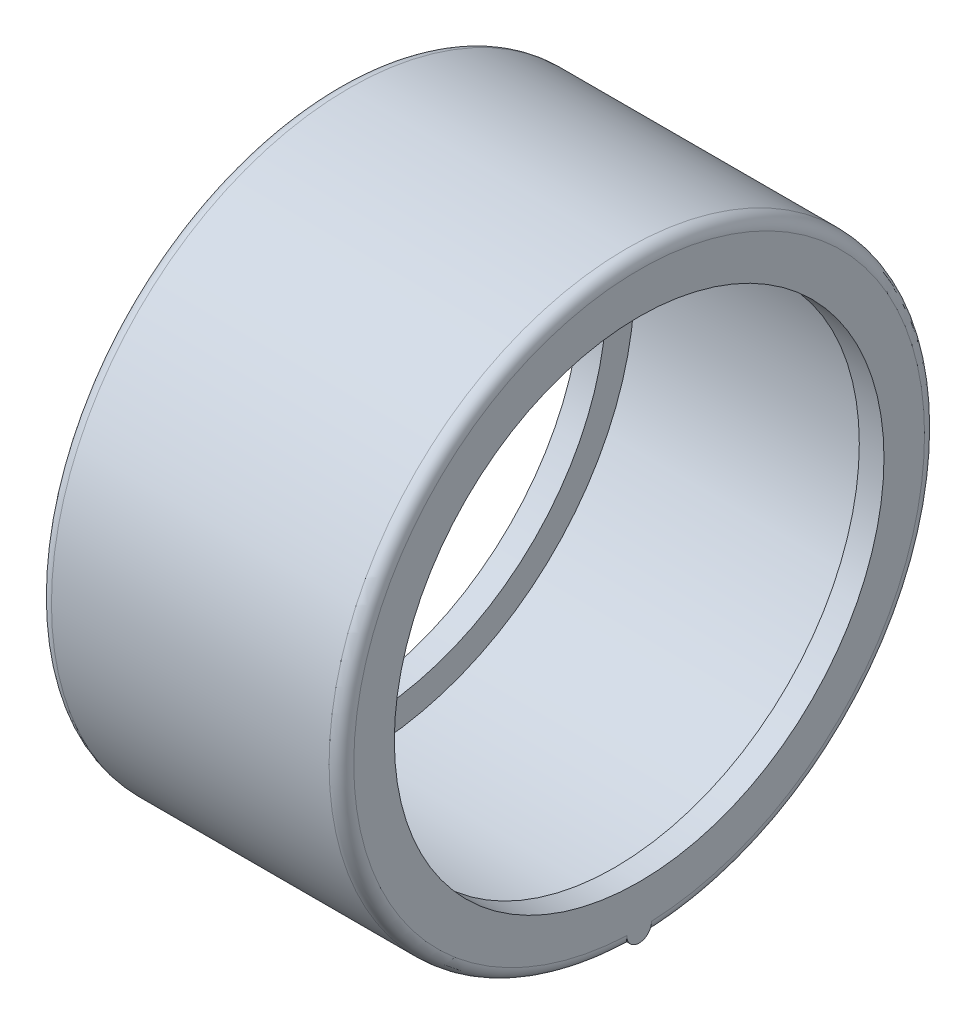
ISO-10303-21;
HEADER;
FILE_DESCRIPTION(('STEP AP214'),'2;1');
FILE_NAME('part.step','',(''),(''),'','','');
FILE_SCHEMA(('AUTOMOTIVE_DESIGN { 1 0 10303 214 1 1 1 1 }'));
ENDSEC;
DATA;
#1=APPLICATION_CONTEXT('core data for automotive mechanical design processes');
#2=APPLICATION_PROTOCOL_DEFINITION('international standard','automotive_design',2000,#1);
#3=PRODUCT_CONTEXT('',#1,'mechanical');
#4=PRODUCT('Part','Part','',(#3));
#5=PRODUCT_RELATED_PRODUCT_CATEGORY('part','',(#4));
#6=PRODUCT_DEFINITION_FORMATION('','',#4);
#7=PRODUCT_DEFINITION_CONTEXT('part definition',#1,'design');
#8=PRODUCT_DEFINITION('design','',#6,#7);
#9=PRODUCT_DEFINITION_SHAPE('','',#8);
#10=(LENGTH_UNIT() NAMED_UNIT(*) SI_UNIT(.MILLI.,.METRE.));
#11=(NAMED_UNIT(*) PLANE_ANGLE_UNIT() SI_UNIT($,.RADIAN.));
#12=(NAMED_UNIT(*) SI_UNIT($,.STERADIAN.) SOLID_ANGLE_UNIT());
#13=UNCERTAINTY_MEASURE_WITH_UNIT(LENGTH_MEASURE(1.E-05),#10,'distance_accuracy_value','');
#14=(GEOMETRIC_REPRESENTATION_CONTEXT(3) GLOBAL_UNCERTAINTY_ASSIGNED_CONTEXT((#13)) GLOBAL_UNIT_ASSIGNED_CONTEXT((#10,
#11,#12)) REPRESENTATION_CONTEXT('',''));
#15=CARTESIAN_POINT('',(0.,0.,0.));
#16=DIRECTION('',(0.,0.,1.));
#17=DIRECTION('',(1.,0.,0.));
#18=AXIS2_PLACEMENT_3D('',#15,#16,#17);
#19=CARTESIAN_POINT('',(-137.660777116751,-198.425,0.));
#20=DIRECTION('',(1.,0.,0.));
#21=DIRECTION('',(0.,1.,0.));
#22=AXIS2_PLACEMENT_3D('',#19,#20,#21);
#23=CYLINDRICAL_SURFACE('',#22,198.425);
#24=CARTESIAN_POINT('',(0.,-198.425,0.));
#25=DIRECTION('',(1.,0.,0.));
#26=DIRECTION('',(0.,1.,0.));
#27=AXIS2_PLACEMENT_3D('',#24,#25,#26);
#28=CIRCLE('',#27,198.425);
#29=CARTESIAN_POINT('',(0.,0.,0.));
#30=VERTEX_POINT('',#29);
#31=EDGE_CURVE('E78',#30,#30,#28,.T.);
#32=ORIENTED_EDGE('',*,*,#31,.T.);
#33=EDGE_LOOP('',(#32));
#34=FACE_BOUND('',#33,.T.);
#35=CARTESIAN_POINT('',(-20.,-198.425,0.));
#36=DIRECTION('',(1.,0.,0.));
#37=DIRECTION('',(0.,1.,0.));
#38=AXIS2_PLACEMENT_3D('',#35,#36,#37);
#39=CIRCLE('',#38,198.425);
#40=CARTESIAN_POINT('',(-20.,0.,0.));
#41=VERTEX_POINT('',#40);
#42=EDGE_CURVE('E135',#41,#41,#39,.T.);
#43=ORIENTED_EDGE('',*,*,#42,.F.);
#44=EDGE_LOOP('',(#43));
#45=FACE_BOUND('',#44,.T.);
#46=ADVANCED_FACE('F35',(#34,#45),#23,.F.);
#47=CARTESIAN_POINT('',(0.,0.,0.));
#48=DIRECTION('',(1.,0.,0.));
#49=DIRECTION('',(0.,1.,0.));
#50=AXIS2_PLACEMENT_3D('',#47,#48,#49);
#51=PLANE('',#50);
#52=CARTESIAN_POINT('',(0.,-198.425,0.));
#53=DIRECTION('',(1.,0.,0.));
#54=DIRECTION('',(0.,1.,0.));
#55=AXIS2_PLACEMENT_3D('',#52,#53,#54);
#56=CIRCLE('',#55,231.3);
#57=CARTESIAN_POINT('',(0.,-429.508830523133,-9.997663264847));
#58=VERTEX_POINT('',#57);
#59=CARTESIAN_POINT('',(0.,-429.50883052313,9.99766326484694));
#60=VERTEX_POINT('',#59);
#61=EDGE_CURVE('E72',#58,#60,#56,.T.);
#62=ORIENTED_EDGE('',*,*,#61,.T.);
#63=CARTESIAN_POINT('',(0.,-429.725,0.));
#64=DIRECTION('',(1.,0.,0.));
#65=DIRECTION('',(0.,1.,0.));
#66=AXIS2_PLACEMENT_3D('',#63,#64,#65);
#67=CIRCLE('',#66,10.);
#68=EDGE_CURVE('E82',#60,#58,#67,.T.);
#69=ORIENTED_EDGE('',*,*,#68,.T.);
#70=EDGE_LOOP('',(#62,#69));
#71=FACE_BOUND('',#70,.T.);
#72=ORIENTED_EDGE('',*,*,#31,.F.);
#73=EDGE_LOOP('',(#72));
#74=FACE_BOUND('',#73,.T.);
#75=ADVANCED_FACE('F85',(#71,#74),#51,.T.);
#76=CARTESIAN_POINT('',(-137.660777116751,-198.425,0.));
#77=DIRECTION('',(1.,0.,0.));
#78=DIRECTION('',(0.,1.,0.));
#79=AXIS2_PLACEMENT_3D('',#76,#77,#78);
#80=CYLINDRICAL_SURFACE('',#79,241.3);
#81=CARTESIAN_POINT('',(-9.99999999999998,-198.425,0.));
#82=DIRECTION('',(1.,0.,0.));
#83=DIRECTION('',(0.,1.,0.));
#84=AXIS2_PLACEMENT_3D('',#81,#82,#83);
#85=CIRCLE('',#84,241.3);
#86=CARTESIAN_POINT('',(-9.99999999999996,-439.725,0.));
#87=VERTEX_POINT('',#86);
#88=EDGE_CURVE('E118',#87,#87,#85,.F.);
#89=ORIENTED_EDGE('',*,*,#88,.T.);
#90=EDGE_LOOP('',(#89));
#91=FACE_BOUND('',#90,.T.);
#92=CARTESIAN_POINT('',(-235.,-198.425,0.));
#93=DIRECTION('',(-1.,0.,0.));
#94=DIRECTION('',(0.,-1.,0.));
#95=AXIS2_PLACEMENT_3D('',#92,#93,#94);
#96=CIRCLE('',#95,241.3);
#97=CARTESIAN_POINT('',(-235.,-439.725,0.));
#98=VERTEX_POINT('',#97);
#99=EDGE_CURVE('E77',#98,#98,#96,.F.);
#100=ORIENTED_EDGE('',*,*,#99,.T.);
#101=EDGE_LOOP('',(#100));
#102=FACE_BOUND('',#101,.T.);
#103=ADVANCED_FACE('F147',(#91,#102),#80,.T.);
#104=CARTESIAN_POINT('',(-245.,42.875,0.));
#105=DIRECTION('',(-1.,0.,0.));
#106=DIRECTION('',(0.,-1.,0.));
#107=AXIS2_PLACEMENT_3D('',#104,#105,#106);
#108=PLANE('',#107);
#109=CARTESIAN_POINT('',(-245.,-198.425,0.));
#110=DIRECTION('',(-1.,0.,0.));
#111=DIRECTION('',(0.,-1.,0.));
#112=AXIS2_PLACEMENT_3D('',#109,#110,#111);
#113=CIRCLE('',#112,231.3);
#114=CARTESIAN_POINT('',(-245.,-429.508830523133,9.99766326484699));
#115=VERTEX_POINT('',#114);
#116=CARTESIAN_POINT('',(-245.,-429.50883052313,-9.99766326484694));
#117=VERTEX_POINT('',#116);
#118=EDGE_CURVE('E115',#115,#117,#113,.T.);
#119=ORIENTED_EDGE('',*,*,#118,.T.);
#120=CARTESIAN_POINT('',(-245.,-429.725,0.));
#121=DIRECTION('',(-1.,0.,0.));
#122=DIRECTION('',(0.,-1.,0.));
#123=AXIS2_PLACEMENT_3D('',#120,#121,#122);
#124=CIRCLE('',#123,10.);
#125=EDGE_CURVE('E83',#115,#117,#124,.F.);
#126=ORIENTED_EDGE('',*,*,#125,.F.);
#127=EDGE_LOOP('',(#119,#126));
#128=FACE_BOUND('',#127,.T.);
#129=CARTESIAN_POINT('',(-245.,-198.425,0.));
#130=DIRECTION('',(1.,0.,0.));
#131=DIRECTION('',(0.,1.,0.));
#132=AXIS2_PLACEMENT_3D('',#129,#130,#131);
#133=CIRCLE('',#132,198.425);
#134=CARTESIAN_POINT('',(-245.,0.,0.));
#135=VERTEX_POINT('',#134);
#136=EDGE_CURVE('E124',#135,#135,#133,.T.);
#137=ORIENTED_EDGE('',*,*,#136,.T.);
#138=EDGE_LOOP('',(#137));
#139=FACE_BOUND('',#138,.T.);
#140=ADVANCED_FACE('F152',(#128,#139),#108,.T.);
#141=CARTESIAN_POINT('',(-137.660777116751,-198.425,0.));
#142=DIRECTION('',(1.,0.,0.));
#143=DIRECTION('',(0.,1.,0.));
#144=AXIS2_PLACEMENT_3D('',#141,#142,#143);
#145=CYLINDRICAL_SURFACE('',#144,198.425);
#146=CARTESIAN_POINT('',(-225.,-198.425,0.));
#147=DIRECTION('',(1.,0.,0.));
#148=DIRECTION('',(0.,1.,0.));
#149=AXIS2_PLACEMENT_3D('',#146,#147,#148);
#150=CIRCLE('',#149,198.425);
#151=CARTESIAN_POINT('',(-225.,0.,0.));
#152=VERTEX_POINT('',#151);
#153=EDGE_CURVE('E127',#152,#152,#150,.T.);
#154=ORIENTED_EDGE('',*,*,#153,.T.);
#155=EDGE_LOOP('',(#154));
#156=FACE_BOUND('',#155,.T.);
#157=ORIENTED_EDGE('',*,*,#136,.F.);
#158=EDGE_LOOP('',(#157));
#159=FACE_BOUND('',#158,.T.);
#160=ADVANCED_FACE('F156',(#156,#159),#145,.F.);
#161=CARTESIAN_POINT('',(-225.,0.,0.));
#162=DIRECTION('',(1.,0.,0.));
#163=DIRECTION('',(0.,1.,0.));
#164=AXIS2_PLACEMENT_3D('',#161,#162,#163);
#165=PLANE('',#164);
#166=CARTESIAN_POINT('',(-225.,-198.425,0.));
#167=DIRECTION('',(1.,0.,0.));
#168=DIRECTION('',(0.,1.,0.));
#169=AXIS2_PLACEMENT_3D('',#166,#167,#168);
#170=CIRCLE('',#169,221.3);
#171=CARTESIAN_POINT('',(-225.,22.875,0.));
#172=VERTEX_POINT('',#171);
#173=EDGE_CURVE('E130',#172,#172,#170,.T.);
#174=ORIENTED_EDGE('',*,*,#173,.T.);
#175=EDGE_LOOP('',(#174));
#176=FACE_BOUND('',#175,.T.);
#177=ORIENTED_EDGE('',*,*,#153,.F.);
#178=EDGE_LOOP('',(#177));
#179=FACE_BOUND('',#178,.T.);
#180=ADVANCED_FACE('F160',(#176,#179),#165,.T.);
#181=CARTESIAN_POINT('',(-137.660777116751,-198.425,0.));
#182=DIRECTION('',(1.,0.,0.));
#183=DIRECTION('',(0.,1.,0.));
#184=AXIS2_PLACEMENT_3D('',#181,#182,#183);
#185=CYLINDRICAL_SURFACE('',#184,221.3);
#186=CARTESIAN_POINT('',(-20.,-198.425,0.));
#187=DIRECTION('',(1.,0.,0.));
#188=DIRECTION('',(0.,1.,0.));
#189=AXIS2_PLACEMENT_3D('',#186,#187,#188);
#190=CIRCLE('',#189,221.3);
#191=CARTESIAN_POINT('',(-20.,22.875,0.));
#192=VERTEX_POINT('',#191);
#193=EDGE_CURVE('E133',#192,#192,#190,.T.);
#194=ORIENTED_EDGE('',*,*,#193,.T.);
#195=EDGE_LOOP('',(#194));
#196=FACE_BOUND('',#195,.T.);
#197=ORIENTED_EDGE('',*,*,#173,.F.);
#198=EDGE_LOOP('',(#197));
#199=FACE_BOUND('',#198,.T.);
#200=ADVANCED_FACE('F163',(#196,#199),#185,.F.);
#201=CARTESIAN_POINT('',(-20.,22.875,0.));
#202=DIRECTION('',(-1.,0.,0.));
#203=DIRECTION('',(0.,-1.,0.));
#204=AXIS2_PLACEMENT_3D('',#201,#202,#203);
#205=PLANE('',#204);
#206=ORIENTED_EDGE('',*,*,#42,.T.);
#207=EDGE_LOOP('',(#206));
#208=FACE_BOUND('',#207,.T.);
#209=ORIENTED_EDGE('',*,*,#193,.F.);
#210=EDGE_LOOP('',(#209));
#211=FACE_BOUND('',#210,.T.);
#212=ADVANCED_FACE('F105',(#208,#211),#205,.T.);
#213=CARTESIAN_POINT('',(-9.99999999999998,-198.425,0.));
#214=DIRECTION('',(1.,0.,0.));
#215=DIRECTION('',(0.,1.,0.));
#216=AXIS2_PLACEMENT_3D('',#213,#214,#215);
#217=TOROIDAL_SURFACE('',#216,231.3,10.);
#218=CARTESIAN_POINT('',(-9.99999999999996,-419.725,0.));
#219=CARTESIAN_POINT('',(-9.99523418838041,-419.725000002754,0.00466165107700827));
#220=CARTESIAN_POINT('',(-9.99046834941142,-419.725003262332,0.00932332890342473));
#221=CARTESIAN_POINT('',(-9.58971866214494,-419.725551237811,0.401314344351611));
#222=CARTESIAN_POINT('',(-9.19356576719073,-419.748578543602,0.788811201528783));
#223=CARTESIAN_POINT('',(-8.40387947588709,-419.840013644477,1.56161002287549));
#224=CARTESIAN_POINT('',(-8.01034848124591,-419.908458460492,1.94690993763456));
#225=CARTESIAN_POINT('',(-7.22838777058326,-420.092045737569,2.71325247235718));
#226=CARTESIAN_POINT('',(-6.83996986461044,-420.207281552126,3.09428500754622));
#227=CARTESIAN_POINT('',(-6.07280673935722,-420.486256126734,3.84798560440278));
#228=CARTESIAN_POINT('',(-5.69405564353207,-420.649964618281,4.22065873029262));
#229=CARTESIAN_POINT('',(-5.07328738662138,-420.965951846032,4.83274131467661));
#230=CARTESIAN_POINT('',(-4.82740030381804,-421.104169187109,5.07553742762835));
#231=CARTESIAN_POINT('',(-4.3434961227254,-421.404488050657,5.55418060305732));
#232=CARTESIAN_POINT('',(-4.1054788452835,-421.566589028968,5.79002782370963));
#233=CARTESIAN_POINT('',(-3.63971302284617,-421.915403968713,6.25251147800173));
#234=CARTESIAN_POINT('',(-3.4119459813006,-422.102070997132,6.47916442327493));
#235=CARTESIAN_POINT('',(-2.96873194093709,-422.501148300006,6.92132447496267));
#236=CARTESIAN_POINT('',(-2.75328143445402,-422.713551190766,7.13683475304511));
#237=CARTESIAN_POINT('',(-2.23504331177814,-423.276502980796,7.65682958942186));
#238=CARTESIAN_POINT('',(-1.9413390831253,-423.643661157166,7.95302051715879));
#239=CARTESIAN_POINT('',(-1.53557840448766,-424.239744516702,8.36482696686989));
#240=CARTESIAN_POINT('',(-1.40613756255552,-424.445969198086,8.49666859278553));
#241=CARTESIAN_POINT('',(-1.1605557718957,-424.873508111215,8.74782357263798));
#242=CARTESIAN_POINT('',(-1.04441198447038,-425.094819106129,8.86713960012609));
#243=CARTESIAN_POINT('',(-0.84915574976487,-425.506144563319,9.06877787432444));
#244=CARTESIAN_POINT('',(-0.767282388589366,-425.693568305645,9.15372668855104));
#245=CARTESIAN_POINT('',(-0.614408795265998,-426.077069685264,9.31320048259181));
#246=CARTESIAN_POINT('',(-0.543406062480872,-426.2731453189,9.38772785937021));
#247=CARTESIAN_POINT('',(-0.413338514396439,-426.673063679014,9.52524923626486));
#248=CARTESIAN_POINT('',(-0.354268529222272,-426.876902996175,9.58824822994613));
#249=CARTESIAN_POINT('',(-0.249003564731425,-427.291310951536,9.70171641745136));
#250=CARTESIAN_POINT('',(-0.202808723492265,-427.501879661875,9.75218547689933));
#251=CARTESIAN_POINT('',(-0.123883421461152,-427.929656897785,9.83995461369808));
#252=CARTESIAN_POINT('',(-0.0912387989433414,-428.146898662997,9.87717053000885));
#253=CARTESIAN_POINT('',(-0.0404569337166763,-428.585043558198,9.93727273522379));
#254=CARTESIAN_POINT('',(-0.0223197333922054,-428.805946698883,9.96015898226284));
#255=CARTESIAN_POINT('',(-0.000890457640047353,-429.249457701923,9.9911593483647));
#256=CARTESIAN_POINT('',(0.00240482890196019,-429.472065185096,9.99927666252553));
#257=CARTESIAN_POINT('',(-0.00585158690631464,-429.917037796625,10.0006306261142));
#258=CARTESIAN_POINT('',(-0.0174022855720803,-430.139402940348,9.99386828148109));
#259=CARTESIAN_POINT('',(-0.0531764886468101,-430.560184072756,9.96706863432268));
#260=CARTESIAN_POINT('',(-0.0760431529479468,-430.758806247629,9.94840110569153));
#261=CARTESIAN_POINT('',(-0.133157107563078,-431.153028925708,9.89950476828482));
#262=CARTESIAN_POINT('',(-0.167408150960718,-431.348628410142,9.869272146353));
#263=CARTESIAN_POINT('',(-0.246688547265281,-431.735502199182,9.79778393019565));
#264=CARTESIAN_POINT('',(-0.291714609773592,-431.926777804704,9.75653170061321));
#265=CARTESIAN_POINT('',(-0.39187064833016,-432.304150734563,9.66363107716939));
#266=CARTESIAN_POINT('',(-0.447004600194565,-432.490245987978,9.61197859170459));
#267=CARTESIAN_POINT('',(-0.56997197989854,-432.866687481059,9.49582745221061));
#268=CARTESIAN_POINT('',(-0.638344921114005,-433.056685008947,9.43077004963431));
#269=CARTESIAN_POINT('',(-0.784583541697343,-433.429247789642,9.29075899273055));
#270=CARTESIAN_POINT('',(-0.862452294553608,-433.611810610432,9.21580213361276));
#271=CARTESIAN_POINT('',(-1.10896893351795,-434.147586828064,8.97738165666732));
#272=CARTESIAN_POINT('',(-1.29056259169467,-434.488993952254,8.8003346829127));
#273=CARTESIAN_POINT('',(-1.63667167566632,-435.063627505953,8.46072701091758));
#274=CARTESIAN_POINT('',(-1.7956814934155,-435.303800628719,8.30402621002114));
#275=CARTESIAN_POINT('',(-2.12748976495512,-435.763711373547,7.97582068289367));
#276=CARTESIAN_POINT('',(-2.30029040075891,-435.983445749788,7.80431361363027));
#277=CARTESIAN_POINT('',(-2.65772396597322,-436.402996781051,7.44850432860324));
#278=CARTESIAN_POINT('',(-2.84238210362913,-436.602768528003,7.26417477887126));
#279=CARTESIAN_POINT('',(-3.2212398557818,-436.982248660822,6.88507569853137));
#280=CARTESIAN_POINT('',(-3.4154393806243,-437.161957235156,6.69030626601873));
#281=CARTESIAN_POINT('',(-3.88359108215538,-437.563419660151,6.21983966590384));
#282=CARTESIAN_POINT('',(-4.16094991278797,-437.77682228877,5.94038495788034));
#283=CARTESIAN_POINT('',(-4.72706340851611,-438.168722071713,5.36877134512692));
#284=CARTESIAN_POINT('',(-5.01582255902688,-438.347205319288,5.07660743530963));
#285=CARTESIAN_POINT('',(-5.60208465726479,-438.670506369172,4.48244618065138));
#286=CARTESIAN_POINT('',(-5.89959024842952,-438.815313873351,4.18044585991319));
#287=CARTESIAN_POINT('',(-6.50095258113213,-439.072218021774,3.56922623818165));
#288=CARTESIAN_POINT('',(-6.80480775654742,-439.184322632463,3.26000871515883));
#289=CARTESIAN_POINT('',(-7.58336406584764,-439.429001882002,2.46698575912371));
#290=CARTESIAN_POINT('',(-8.06129586663591,-439.539671364322,1.9794981731206));
#291=CARTESIAN_POINT('',(-9.02150737835235,-439.68723592392,0.99941765657061));
#292=CARTESIAN_POINT('',(-9.50377707282403,-439.724271131032,0.506836219975861));
#293=CARTESIAN_POINT('',(-9.99047271851868,-439.72499644617,0.00973105303840347));
#294=CARTESIAN_POINT('',(-9.99523637718779,-439.724999997083,0.00486550820134986));
#295=CARTESIAN_POINT('',(-9.99999999999996,-439.725,0.));
#296=B_SPLINE_CURVE_WITH_KNOTS('',3,(#218,#219,#220,#221,#222,#223,#224,#225,#226,#227,#228,
#229,#230,#231,#232,#233,#234,#235,#236,#237,#238,#239,#240,#241,#242,#243,#244,#245,#246,#247,
#248,#249,#250,#251,#252,#253,#254,#255,#256,#257,#258,#259,#260,#261,#262,#263,#264,#265,#266,
#267,#268,#269,#270,#271,#272,#273,#274,#275,#276,#277,#278,#279,#280,#281,#282,#283,#284,#285,
#286,#287,#288,#289,#290,#291,#292,#293,#294,#295),.UNSPECIFIED.,.F.,.F.,(4,2,2,2,2,2,2,2,2,2,2,
2,2,2,2,2,2,2,2,2,2,2,2,2,2,2,2,2,2,2,2,2,2,2,2,2,2,2,4),(0.,0.0200000023907507,
1.68175080371814,3.34485780567202,5.01129933233644,6.67670244518449,7.79243015494649,
8.90813244815619,10.0217333427557,11.1350154950522,12.7951421018459,13.6250063496544,
14.4546931037343,15.118477500884,15.7821089734718,16.4454523074882,17.1088027551554,
17.7762935406632,18.4437862762818,19.1111345899272,19.778437788888,20.3801678501096,
20.982096480517,21.5838415322786,22.1858237829864,22.8216318916479,23.4576463398617,
24.7293284859731,25.711852397692,26.6945320758691,27.6793748523775,28.6642083767232,
30.0057962196553,31.3479172711797,32.6904482087041,34.0326518312229,36.1032272128589,
38.1698583963681,38.1902861635402),.UNSPECIFIED.);
#297=EDGE_CURVE('E55',#60,#87,#296,.T.);
#298=ORIENTED_EDGE('',*,*,#297,.F.);
#299=ORIENTED_EDGE('',*,*,#61,.F.);
#300=CARTESIAN_POINT('',(-9.99999999999996,-439.725,0.));
#301=CARTESIAN_POINT('',(-9.99523637057762,-439.724999998567,-0.00486551496545312));
#302=CARTESIAN_POINT('',(-9.99047271189269,-439.724996447623,-0.00973105982107715));
#303=CARTESIAN_POINT('',(-9.61262343661285,-439.724433228485,-0.395661832875881));
#304=CARTESIAN_POINT('',(-9.23937620062494,-439.702103482957,-0.776890210659339));
#305=CARTESIAN_POINT('',(-8.49505908631422,-439.613614869064,-1.53681559316153));
#306=CARTESIAN_POINT('',(-8.12399116662235,-439.547421301422,-1.91551035385767));
#307=CARTESIAN_POINT('',(-7.38591464620138,-439.370247890305,-2.66814069483715));
#308=CARTESIAN_POINT('',(-7.01891706582044,-439.259167547987,-3.04206364040333));
#309=CARTESIAN_POINT('',(-6.29289785974293,-438.991043289924,-3.78084428019821));
#310=CARTESIAN_POINT('',(-5.93387218695558,-438.834023298176,-4.14570658591266));
#311=CARTESIAN_POINT('',(-5.32431414783951,-438.52206402279,-4.7640755013983));
#312=CARTESIAN_POINT('',(-5.07107294466242,-438.378403964638,-5.02063680516379));
#313=CARTESIAN_POINT('',(-4.57215076804788,-438.065225438598,-5.52528940858376));
#314=CARTESIAN_POINT('',(-4.32646975299386,-437.895707113082,-5.77338075486362));
#315=CARTESIAN_POINT('',(-3.84508917885637,-437.53031282523,-6.25852629295816));
#316=CARTESIAN_POINT('',(-3.60937185946699,-437.334486607795,-6.4956002055063));
#317=CARTESIAN_POINT('',(-3.14983349206253,-436.915395502397,-6.95666687287533));
#318=CARTESIAN_POINT('',(-2.92600889323237,-436.69213887104,-7.18066353417224));
#319=CARTESIAN_POINT('',(-2.54942760156732,-436.279166131866,-7.55640761771281));
#320=CARTESIAN_POINT('',(-2.39331789117365,-436.095810877212,-7.71180343033393));
#321=CARTESIAN_POINT('',(-2.09060124821925,-435.713454835315,-8.01233568914499));
#322=CARTESIAN_POINT('',(-1.94399381918657,-435.514454866677,-8.15747267137073));
#323=CARTESIAN_POINT('',(-1.66203590523833,-435.100958242006,-8.43570514831941));
#324=CARTESIAN_POINT('',(-1.52667612087295,-434.886474667502,-8.56881059876264));
#325=CARTESIAN_POINT('',(-1.26896731782521,-434.442140400212,-8.82121425374433));
#326=CARTESIAN_POINT('',(-1.14661402595438,-434.212294795183,-8.94051699420796));
#327=CARTESIAN_POINT('',(-0.940479003955149,-433.786429010925,-9.14047281641037));
#328=CARTESIAN_POINT('',(-0.853927927999836,-433.593112607582,-9.22403898509596));
#329=CARTESIAN_POINT('',(-0.691504087653256,-433.197797568366,-9.38002072827698));
#330=CARTESIAN_POINT('',(-0.615625336407075,-432.995803883884,-9.45244255657643));
#331=CARTESIAN_POINT('',(-0.475652534831493,-432.583901464922,-9.58506548259098));
#332=CARTESIAN_POINT('',(-0.411556019846118,-432.373994396892,-9.64526913642817));
#333=CARTESIAN_POINT('',(-0.296242671915071,-431.947336654726,-9.75241458574519));
#334=CARTESIAN_POINT('',(-0.245025988817231,-431.730585901002,-9.79935622693157));
#335=CARTESIAN_POINT('',(-0.156163411165492,-431.290049169415,-9.87932685357996));
#336=CARTESIAN_POINT('',(-0.118620834995594,-431.066222976155,-9.91225022319394));
#337=CARTESIAN_POINT('',(-0.0584941834994513,-430.614853510579,-9.96291764302518));
#338=CARTESIAN_POINT('',(-0.0359101509472196,-430.387310227636,-9.98066164983703));
#339=CARTESIAN_POINT('',(-0.00628406790891363,-429.930629307473,-10.0004964998462));
#340=CARTESIAN_POINT('',(0.000764906416835263,-429.701492426203,-10.0025943174076));
#341=CARTESIAN_POINT('',(-0.000896271068661911,-429.243685876314,-9.99103354389576));
#342=CARTESIAN_POINT('',(-0.00960488672543609,-429.015016164327,-9.97737648875904));
#343=CARTESIAN_POINT('',(-0.0407029967157903,-428.586898655706,-9.93707272868785));
#344=CARTESIAN_POINT('',(-0.0613736401016673,-428.387160573253,-9.91213170972357));
#345=CARTESIAN_POINT('',(-0.114563358589861,-427.991089113939,-9.85056927004623));
#346=CARTESIAN_POINT('',(-0.147082724552985,-427.794755820781,-9.81394756259998));
#347=CARTESIAN_POINT('',(-0.223460424912908,-427.406750782216,-9.72960134400253));
#348=CARTESIAN_POINT('',(-0.267318754771973,-427.215079034944,-9.68187683729454));
#349=CARTESIAN_POINT('',(-0.36572047373239,-426.837440855855,-9.57603604214244));
#350=CARTESIAN_POINT('',(-0.420264470778054,-426.651474749349,-9.51791916245695));
#351=CARTESIAN_POINT('',(-0.541168196344502,-426.280336234907,-9.39010158316018));
#352=CARTESIAN_POINT('',(-0.607846079962038,-426.095373474049,-9.32009358326806));
#353=CARTESIAN_POINT('',(-0.750897586726426,-425.733101716174,-9.17077874880737));
#354=CARTESIAN_POINT('',(-0.827274087915657,-425.555795012089,-9.0914691545481));
#355=CARTESIAN_POINT('',(-1.069650147674,-425.036109110546,-8.84092951846405));
#356=CARTESIAN_POINT('',(-1.24893946424419,-424.705834390585,-8.6570429786336));
#357=CARTESIAN_POINT('',(-1.59183268764016,-424.151296154694,-8.30756847128196));
#358=CARTESIAN_POINT('',(-1.74975358117799,-423.919990167008,-8.14730717945704));
#359=CARTESIAN_POINT('',(-2.07987725613793,-423.477972606493,-7.81353235577719));
#360=CARTESIAN_POINT('',(-2.25208249433152,-423.267264589951,-7.6400165446786));
#361=CARTESIAN_POINT('',(-2.6087606483882,-422.865737317755,-7.28169791346052));
#362=CARTESIAN_POINT('',(-2.79326108900926,-422.67496532108,-7.09686984998157));
#363=CARTESIAN_POINT('',(-3.17214449342987,-422.313275140392,-6.7182490800368));
#364=CARTESIAN_POINT('',(-3.36652735237922,-422.142356745799,-6.52445646868474));
#365=CARTESIAN_POINT('',(-3.84366736200942,-421.754505130948,-6.04974397752253));
#366=CARTESIAN_POINT('',(-4.13042091985143,-421.546852271975,-5.76523493028258));
#367=CARTESIAN_POINT('',(-4.71631879400985,-421.167346593326,-5.18524270401659));
#368=CARTESIAN_POINT('',(-5.01546860447693,-420.995509855653,-4.88975466511318));
#369=CARTESIAN_POINT('',(-5.62315792127466,-420.685927868612,-4.29056094247747));
#370=CARTESIAN_POINT('',(-5.93170019327277,-420.548192771882,-3.98685284127492));
#371=CARTESIAN_POINT('',(-6.55551992935183,-420.305480813205,-3.37362566820363));
#372=CARTESIAN_POINT('',(-6.87079553248329,-420.200495022093,-3.06410820471277));
#373=CARTESIAN_POINT('',(-7.64850778678867,-419.982091021756,-2.30133014853526));
#374=CARTESIAN_POINT('',(-8.11360631668396,-419.885959320109,-1.84578336212525));
#375=CARTESIAN_POINT('',(-9.04780041291339,-419.757796699759,-0.931391554933025));
#376=CARTESIAN_POINT('',(-9.5168872760452,-419.72565069293,-0.472553948352679));
#377=CARTESIAN_POINT('',(-9.99046835298805,-419.725003263677,-0.00932332542664659));
#378=CARTESIAN_POINT('',(-9.99523419193967,-419.725000004121,-0.00466164760990721));
#379=CARTESIAN_POINT('',(-9.99999999999996,-419.725,0.));
#380=B_SPLINE_CURVE_WITH_KNOTS('',3,(#300,#301,#302,#303,#304,#305,#306,#307,#308,#309,#310,
#311,#312,#313,#314,#315,#316,#317,#318,#319,#320,#321,#322,#323,#324,#325,#326,#327,#328,#329,
#330,#331,#332,#333,#334,#335,#336,#337,#338,#339,#340,#341,#342,#343,#344,#345,#346,#347,#348,
#349,#350,#351,#352,#353,#354,#355,#356,#357,#358,#359,#360,#361,#362,#363,#364,#365,#366,#367,
#368,#369,#370,#371,#372,#373,#374,#375,#376,#377,#378,#379),.UNSPECIFIED.,.F.,.F.,(4,2,2,2,2,2,
2,2,2,2,2,2,2,2,2,2,2,2,2,2,2,2,2,2,2,2,2,2,2,2,2,2,2,2,2,2,2,2,2,4),(0.,0.0204277671721091,
1.62030381097562,3.2214469792039,4.82619505271476,6.43010890435831,7.59338850335299,
8.75666169769707,9.91776546140131,11.078520583004,11.9376307057975,12.7966959058557,
13.6550436211001,14.5131084551573,15.1955725652448,15.8776522932697,16.5595891783181,
17.2415339968579,17.9285294866395,18.6155269408789,19.3022181443837,19.9888424082784,
20.5951763695422,21.2015252160114,21.8078738198265,22.41425693092,23.0397469601371,
23.6654230377413,24.9163466680157,25.8832154315185,26.8502508334294,27.8195289668359,
28.7887968185677,30.1493722737845,31.5105573389558,32.8721471660018,34.2333654275965,
36.2043007762325,38.171687879131,38.1916878815218),.UNSPECIFIED.);
#381=EDGE_CURVE('E60',#87,#58,#380,.T.);
#382=ORIENTED_EDGE('',*,*,#381,.F.);
#383=ORIENTED_EDGE('',*,*,#88,.F.);
#384=EDGE_LOOP('',(#298,#299,#382,#383));
#385=FACE_BOUND('',#384,.T.);
#386=ADVANCED_FACE('F73',(#385),#217,.T.);
#387=CARTESIAN_POINT('',(-235.,-198.425,0.));
#388=DIRECTION('',(-1.,0.,0.));
#389=DIRECTION('',(0.,-1.,0.));
#390=AXIS2_PLACEMENT_3D('',#387,#388,#389);
#391=TOROIDAL_SURFACE('',#390,231.3,10.);
#392=CARTESIAN_POINT('',(-235.,-419.725,0.));
#393=CARTESIAN_POINT('',(-235.004765811622,-419.725000002754,-0.00466165107473794));
#394=CARTESIAN_POINT('',(-235.009531650593,-419.725003262332,-0.00932332889893079));
#395=CARTESIAN_POINT('',(-235.410281338042,-419.725551237813,-0.401314344168412));
#396=CARTESIAN_POINT('',(-235.806434232867,-419.748578543603,-0.788811201486681));
#397=CARTESIAN_POINT('',(-236.596120524081,-419.840013644479,-1.56161002294198));
#398=CARTESIAN_POINT('',(-236.989651518762,-419.908458460496,-1.94690993766841));
#399=CARTESIAN_POINT('',(-237.771612229459,-420.092045737577,-2.71325247237208));
#400=CARTESIAN_POINT('',(-238.160030135426,-420.207281552136,-3.0942850075749));
#401=CARTESIAN_POINT('',(-238.92719326068,-420.486256126751,-3.84798560444602));
#402=CARTESIAN_POINT('',(-239.305944356511,-420.649964618301,-4.22065873033666));
#403=CARTESIAN_POINT('',(-239.926712613424,-420.965951846056,-4.8327413147202));
#404=CARTESIAN_POINT('',(-240.172599696224,-421.104169187134,-5.07553742766983));
#405=CARTESIAN_POINT('',(-240.656503877311,-421.404488050682,-5.55418060309409));
#406=CARTESIAN_POINT('',(-240.894521154751,-421.566589028992,-5.7900278237438));
#407=CARTESIAN_POINT('',(-241.360286977183,-421.915403968737,-6.25251147803087));
#408=CARTESIAN_POINT('',(-241.588054018726,-422.102070997154,-6.47916442330165));
#409=CARTESIAN_POINT('',(-242.031268059085,-422.501148300028,-6.92132447498462));
#410=CARTESIAN_POINT('',(-242.246718565565,-422.713551190786,-7.13683475306471));
#411=CARTESIAN_POINT('',(-242.764956688238,-423.276502980816,-7.65682958943832));
#412=CARTESIAN_POINT('',(-243.05866091689,-423.643661157186,-7.95302051717434));
#413=CARTESIAN_POINT('',(-243.464421595526,-424.239744516724,-8.36482696688393));
#414=CARTESIAN_POINT('',(-243.593862437458,-424.445969198108,-8.49666859279904));
#415=CARTESIAN_POINT('',(-243.839444228116,-424.873508111237,-8.74782357265045));
#416=CARTESIAN_POINT('',(-243.955588015541,-425.094819106152,-8.86713960013802));
#417=CARTESIAN_POINT('',(-244.150844250245,-425.506144563342,-9.06877787433525));
#418=CARTESIAN_POINT('',(-244.23271761142,-425.693568305668,-9.15372668856129));
#419=CARTESIAN_POINT('',(-244.385591204743,-426.077069685287,-9.31320048260093));
#420=CARTESIAN_POINT('',(-244.456593937527,-426.273145318923,-9.38772785937876));
#421=CARTESIAN_POINT('',(-244.58666148561,-426.673063679037,-9.52524923627229));
#422=CARTESIAN_POINT('',(-244.645731470784,-426.876902996199,-9.588248229953));
#423=CARTESIAN_POINT('',(-244.750996435274,-427.291310951559,-9.70171641745712));
#424=CARTESIAN_POINT('',(-244.797191276512,-427.501879661898,-9.75218547690451));
#425=CARTESIAN_POINT('',(-244.876116578542,-427.929656897807,-9.83995461370215));
#426=CARTESIAN_POINT('',(-244.90876120106,-428.146898663019,-9.87717053001238));
#427=CARTESIAN_POINT('',(-244.959543066285,-428.58504355822,-9.93727273522626));
#428=CARTESIAN_POINT('',(-244.977680266609,-428.805946698904,-9.9601589822648));
#429=CARTESIAN_POINT('',(-244.99910954236,-429.249457701944,-9.99115934836567));
#430=CARTESIAN_POINT('',(-245.002404828902,-429.472065185116,-9.99927666252603));
#431=CARTESIAN_POINT('',(-244.994148413093,-429.917037796644,-10.0006306261138));
#432=CARTESIAN_POINT('',(-244.982597714427,-430.139402940367,-9.9938682814803));
#433=CARTESIAN_POINT('',(-244.946823511351,-430.560184072775,-9.96706863432114));
#434=CARTESIAN_POINT('',(-244.92395684705,-430.758806247647,-9.94840110568963));
#435=CARTESIAN_POINT('',(-244.866842892434,-431.153028925726,-9.89950476828224));
#436=CARTESIAN_POINT('',(-244.832591849036,-431.34862841016,-9.8692721463501));
#437=CARTESIAN_POINT('',(-244.753311452731,-431.735502199199,-9.79778393019211));
#438=CARTESIAN_POINT('',(-244.708285390222,-431.926777804721,-9.75653170060935));
#439=CARTESIAN_POINT('',(-244.608129351665,-432.30415073458,-9.66363107716494));
#440=CARTESIAN_POINT('',(-244.5529953998,-432.490245987994,-9.61197859169986));
#441=CARTESIAN_POINT('',(-244.430028020096,-432.866687481075,-9.49582745220525));
#442=CARTESIAN_POINT('',(-244.36165507888,-433.056685008964,-9.43077004962858));
#443=CARTESIAN_POINT('',(-244.215416458296,-433.429247789658,-9.29075899272411));
#444=CARTESIAN_POINT('',(-244.137547705439,-433.611810610448,-9.21580213360598));
#445=CARTESIAN_POINT('',(-243.891031066474,-434.14758682808,-8.97738165665951));
#446=CARTESIAN_POINT('',(-243.709437408297,-434.488993952269,-8.8003346829042));
#447=CARTESIAN_POINT('',(-243.363328324324,-435.063627505969,-8.46072701090774));
#448=CARTESIAN_POINT('',(-243.204318506574,-435.303800628735,-8.30402621001063));
#449=CARTESIAN_POINT('',(-242.872510235033,-435.763711373563,-7.97582068288183));
#450=CARTESIAN_POINT('',(-242.699709599228,-435.983445749804,-7.80431361361778));
#451=CARTESIAN_POINT('',(-242.342276034013,-436.402996781066,-7.44850432858946));
#452=CARTESIAN_POINT('',(-242.157617896356,-436.602768528019,-7.26417477885684));
#453=CARTESIAN_POINT('',(-241.778760144202,-436.982248660837,-6.88507569851569));
#454=CARTESIAN_POINT('',(-241.584560619359,-437.161957235171,-6.69030626600243));
#455=CARTESIAN_POINT('',(-241.116408917827,-437.563419660165,-6.21983966588609));
#456=CARTESIAN_POINT('',(-240.839050087194,-437.776822288784,-5.94038495786172));
#457=CARTESIAN_POINT('',(-240.272936591464,-438.168722071725,-5.36877134510714));
#458=CARTESIAN_POINT('',(-239.984177440952,-438.3472053193,-5.07660743528957));
#459=CARTESIAN_POINT('',(-239.397915342714,-438.670506369183,-4.48244618062847));
#460=CARTESIAN_POINT('',(-239.10040975155,-438.815313873361,-4.18044585988773));
#461=CARTESIAN_POINT('',(-238.499047418841,-439.072218021783,-3.56922623815974));
#462=CARTESIAN_POINT('',(-238.195192243418,-439.184322632472,-3.26000871514304));
#463=CARTESIAN_POINT('',(-237.416635934146,-439.429001882007,-2.46698575908753));
#464=CARTESIAN_POINT('',(-236.938704133416,-439.539671364326,-1.97949817303574));
#465=CARTESIAN_POINT('',(-235.97849262157,-439.68723592392,-0.999417656629211));
#466=CARTESIAN_POINT('',(-235.496222926911,-439.72427113103,-0.50683622022616));
#467=CARTESIAN_POINT('',(-235.009527281476,-439.72499644617,-0.00973105304340942));
#468=CARTESIAN_POINT('',(-235.004763622809,-439.724999997083,-0.00486550820387433));
#469=CARTESIAN_POINT('',(-235.,-439.725,0.));
#470=B_SPLINE_CURVE_WITH_KNOTS('',3,(#392,#393,#394,#395,#396,#397,#398,#399,#400,#401,#402,
#403,#404,#405,#406,#407,#408,#409,#410,#411,#412,#413,#414,#415,#416,#417,#418,#419,#420,#421,
#422,#423,#424,#425,#426,#427,#428,#429,#430,#431,#432,#433,#434,#435,#436,#437,#438,#439,#440,
#441,#442,#443,#444,#445,#446,#447,#448,#449,#450,#451,#452,#453,#454,#455,#456,#457,#458,#459,
#460,#461,#462,#463,#464,#465,#466,#467,#468,#469),.UNSPECIFIED.,.F.,.F.,(4,2,2,2,2,2,2,2,2,2,2,
2,2,2,2,2,2,2,2,2,2,2,2,2,2,2,2,2,2,2,2,2,2,2,2,2,2,2,4),(0.,0.020000002390736,1.68175080373581,
3.34485780570732,5.01129933238944,6.67670244525504,7.79243015500723,8.90813244820711,
10.0217333427965,11.135015495083,12.7951421018751,13.625006349683,14.4546931037623,
15.1184775009109,15.7821089734974,16.4454523075128,17.1088027551788,17.7762935406854,
18.4437862763027,19.1111345899469,19.7784377889066,20.380167850128,20.9820964805351,
21.5838415322965,22.1858237830041,22.8216318916663,23.4576463398807,24.7293284859934,
25.7118523977143,26.6945320758934,27.6793748524035,28.6642083767511,30.0057962196853,
31.347917271212,32.6904482087388,34.03265183126,36.1032272128773,38.1698583963682,
38.1902861635403),.UNSPECIFIED.);
#471=EDGE_CURVE('E11',#117,#98,#470,.T.);
#472=ORIENTED_EDGE('',*,*,#471,.F.);
#473=ORIENTED_EDGE('',*,*,#118,.F.);
#474=CARTESIAN_POINT('',(-235.,-439.725,0.));
#475=CARTESIAN_POINT('',(-235.00476362942,-439.724999998567,0.0048655149677275));
#476=CARTESIAN_POINT('',(-235.009527288103,-439.724996447623,0.00973105982557619));
#477=CARTESIAN_POINT('',(-235.387376563209,-439.724433228484,0.395661833056556));
#478=CARTESIAN_POINT('',(-235.760623799333,-439.702103482956,0.776890210713854));
#479=CARTESIAN_POINT('',(-236.504940913748,-439.613614869062,1.5368155931279));
#480=CARTESIAN_POINT('',(-236.876008833407,-439.547421301419,1.91551035386218));
#481=CARTESIAN_POINT('',(-237.614085353809,-439.370247890298,2.66814069487372));
#482=CARTESIAN_POINT('',(-237.981082934202,-439.259167547979,3.04206364043372));
#483=CARTESIAN_POINT('',(-238.707102140293,-438.99104328991,3.78084428022797));
#484=CARTESIAN_POINT('',(-239.066127813081,-438.83402329816,4.14570658594799));
#485=CARTESIAN_POINT('',(-239.675685852196,-438.52206402277,4.76407550143572));
#486=CARTESIAN_POINT('',(-239.928927055372,-438.378403964618,5.02063680519882));
#487=CARTESIAN_POINT('',(-240.427849231983,-438.065225438577,5.52528940861453));
#488=CARTESIAN_POINT('',(-240.673530247035,-437.895707113062,5.77338075489253));
#489=CARTESIAN_POINT('',(-241.154910821168,-437.53031282521,6.25852629298323));
#490=CARTESIAN_POINT('',(-241.390628140556,-437.334486607776,6.4956002055294));
#491=CARTESIAN_POINT('',(-241.850166507957,-436.915395502379,6.9566668728946));
#492=CARTESIAN_POINT('',(-242.073991106785,-436.692138871022,7.18066353418965));
#493=CARTESIAN_POINT('',(-242.450572398448,-436.279166131849,7.55640761772796));
#494=CARTESIAN_POINT('',(-242.606682108841,-436.095810877194,7.7118034303486));
#495=CARTESIAN_POINT('',(-242.909398751794,-435.713454835297,8.0123356891587));
#496=CARTESIAN_POINT('',(-243.056006180827,-435.514454866659,8.15747267138395));
#497=CARTESIAN_POINT('',(-243.337964094774,-435.100958241987,8.43570514833165));
#498=CARTESIAN_POINT('',(-243.473323879139,-434.886474667483,8.56881059877437));
#499=CARTESIAN_POINT('',(-243.731032682186,-434.442140400192,8.82121425375501));
#500=CARTESIAN_POINT('',(-243.853385974056,-434.212294795163,8.94051699421811));
#501=CARTESIAN_POINT('',(-244.059520996054,-433.786429010904,9.14047281641945));
#502=CARTESIAN_POINT('',(-244.146072072009,-433.593112607561,9.22403898510452));
#503=CARTESIAN_POINT('',(-244.308495912355,-433.197797568346,9.38002072828452));
#504=CARTESIAN_POINT('',(-244.3843746636,-432.995803883864,9.45244255658348));
#505=CARTESIAN_POINT('',(-244.524347465175,-432.583901464902,9.585065482597));
#506=CARTESIAN_POINT('',(-244.58844398016,-432.373994396872,9.64526913643366));
#507=CARTESIAN_POINT('',(-244.70375732809,-431.947336654706,9.75241458574969));
#508=CARTESIAN_POINT('',(-244.754974011187,-431.730585900982,9.7993562269356));
#509=CARTESIAN_POINT('',(-244.843836588838,-431.290049169395,9.87932685358302));
#510=CARTESIAN_POINT('',(-244.881379165007,-431.066222976136,9.91225022319652));
#511=CARTESIAN_POINT('',(-244.941505816502,-430.614853510561,9.96291764302682));
#512=CARTESIAN_POINT('',(-244.964089849054,-430.387310227618,9.98066164983822));
#513=CARTESIAN_POINT('',(-244.993715932092,-429.930629307455,10.0004964998465));
#514=CARTESIAN_POINT('',(-245.000764906417,-429.701492426186,10.0025943174076));
#515=CARTESIAN_POINT('',(-244.999103728931,-429.243685876298,9.99103354389496));
#516=CARTESIAN_POINT('',(-244.990395113274,-429.015016164311,9.97737648875789));
#517=CARTESIAN_POINT('',(-244.959297003283,-428.58689865569,9.93707272868608));
#518=CARTESIAN_POINT('',(-244.938626359896,-428.387160573238,9.91213170972151));
#519=CARTESIAN_POINT('',(-244.885436641408,-427.991089113924,9.85056927004359));
#520=CARTESIAN_POINT('',(-244.852917275444,-427.794755820766,9.81394756259708));
#521=CARTESIAN_POINT('',(-244.776539575084,-427.406750782202,9.72960134399911));
#522=CARTESIAN_POINT('',(-244.732681245225,-427.21507903493,9.68187683729089));
#523=CARTESIAN_POINT('',(-244.634279526264,-426.837440855842,9.57603604213834));
#524=CARTESIAN_POINT('',(-244.579735529218,-426.651474749336,9.51791916245263));
#525=CARTESIAN_POINT('',(-244.458831803651,-426.280336234894,9.39010158315537));
#526=CARTESIAN_POINT('',(-244.392153920033,-426.095373474036,9.32009358326295));
#527=CARTESIAN_POINT('',(-244.249102413268,-425.733101716161,9.17077874880172));
#528=CARTESIAN_POINT('',(-244.172725912079,-425.555795012076,9.09146915454219));
#529=CARTESIAN_POINT('',(-243.930349852319,-425.036109110533,8.84092951845735));
#530=CARTESIAN_POINT('',(-243.751060535749,-424.705834390573,8.6570429786264));
#531=CARTESIAN_POINT('',(-243.408167312352,-424.151296154682,8.30756847127373));
#532=CARTESIAN_POINT('',(-243.250246418813,-423.919990166996,8.14730717944827));
#533=CARTESIAN_POINT('',(-242.920122743852,-423.47797260648,7.81353235576732));
#534=CARTESIAN_POINT('',(-242.747917505658,-423.267264589939,7.64001654466818));
#535=CARTESIAN_POINT('',(-242.3912393516,-422.865737317743,7.28169791344904));
#536=CARTESIAN_POINT('',(-242.206738910979,-422.674965321068,7.0968698499696));
#537=CARTESIAN_POINT('',(-241.827855506557,-422.31327514038,6.71824908002382));
#538=CARTESIAN_POINT('',(-241.633472647607,-422.142356745788,6.52445646867125));
#539=CARTESIAN_POINT('',(-241.156332637976,-421.754505130937,6.04974397750798));
#540=CARTESIAN_POINT('',(-240.869579080133,-421.546852271964,5.76523493026753));
#541=CARTESIAN_POINT('',(-240.283681205974,-421.167346593316,5.18524270399992));
#542=CARTESIAN_POINT('',(-239.984531395506,-420.995509855643,4.88975466509541));
#543=CARTESIAN_POINT('',(-239.376842078706,-420.685927868604,4.29056094245979));
#544=CARTESIAN_POINT('',(-239.068299806705,-420.548192771873,3.98685284125844));
#545=CARTESIAN_POINT('',(-238.44448007063,-420.305480813198,3.37362566818052));
#546=CARTESIAN_POINT('',(-238.129204467505,-420.200495022086,3.06410820468186));
#547=CARTESIAN_POINT('',(-237.351492213179,-419.982091021752,2.30133014853096));
#548=CARTESIAN_POINT('',(-236.886393683239,-419.885959320106,1.84578336217397));
#549=CARTESIAN_POINT('',(-235.952199587141,-419.757796699758,0.931391554862106));
#550=CARTESIAN_POINT('',(-235.483112724185,-419.72565069293,0.472553948109513));
#551=CARTESIAN_POINT('',(-235.009531647017,-419.725003263677,0.0093233254217989));
#552=CARTESIAN_POINT('',(-235.004765808063,-419.725000004121,0.00466164760746199));
#553=CARTESIAN_POINT('',(-235.,-419.725,0.));
#554=B_SPLINE_CURVE_WITH_KNOTS('',3,(#474,#475,#476,#477,#478,#479,#480,#481,#482,#483,#484,
#485,#486,#487,#488,#489,#490,#491,#492,#493,#494,#495,#496,#497,#498,#499,#500,#501,#502,#503,
#504,#505,#506,#507,#508,#509,#510,#511,#512,#513,#514,#515,#516,#517,#518,#519,#520,#521,#522,
#523,#524,#525,#526,#527,#528,#529,#530,#531,#532,#533,#534,#535,#536,#537,#538,#539,#540,#541,
#542,#543,#544,#545,#546,#547,#548,#549,#550,#551,#552,#553),.UNSPECIFIED.,.F.,.F.,(4,2,2,2,2,2,
2,2,2,2,2,2,2,2,2,2,2,2,2,2,2,2,2,2,2,2,2,2,2,2,2,2,2,2,2,2,2,2,2,4),(0.,0.0204277671721019,
1.62030381099016,3.22144697923292,4.82619505275826,6.43010890441621,7.59338850340347,
8.75666169774015,9.91776546143685,11.078520583032,11.9376307058245,12.7966959058818,
13.6550436211255,14.5131084551818,15.1955725652682,15.877652293292,16.5595891783393,
17.2415339968781,17.9285294866586,18.6155269408966,19.3022181444004,19.988842408294,
20.5951763695576,21.2015252160265,21.8078738198412,22.4142569309345,23.0397469601521,
23.6654230377567,24.9163466680319,25.8832154315365,26.8502508334491,27.8195289668572,
28.7887968185905,30.1493722738092,31.5105573389826,32.872147166031,34.2333654276281,
36.2043007762484,38.171687879131,38.1916878815218),.UNSPECIFIED.);
#555=EDGE_CURVE('E48',#98,#115,#554,.T.);
#556=ORIENTED_EDGE('',*,*,#555,.F.);
#557=ORIENTED_EDGE('',*,*,#99,.F.);
#558=EDGE_LOOP('',(#472,#473,#556,#557));
#559=FACE_BOUND('',#558,.T.);
#560=ADVANCED_FACE('F37',(#559),#391,.T.);
#561=CARTESIAN_POINT('',(-273.284271247462,-429.725,0.));
#562=DIRECTION('',(1.,0.,0.));
#563=DIRECTION('',(0.,1.,0.));
#564=AXIS2_PLACEMENT_3D('',#561,#562,#563);
#565=CYLINDRICAL_SURFACE('',#564,10.);
#566=ORIENTED_EDGE('',*,*,#125,.T.);
#567=ORIENTED_EDGE('',*,*,#471,.T.);
#568=ORIENTED_EDGE('',*,*,#555,.T.);
#569=EDGE_LOOP('',(#566,#567,#568));
#570=FACE_BOUND('',#569,.T.);
#571=ADVANCED_FACE('F100',(#570),#565,.T.);
#572=ORIENTED_EDGE('',*,*,#68,.F.);
#573=ORIENTED_EDGE('',*,*,#297,.T.);
#574=ORIENTED_EDGE('',*,*,#381,.T.);
#575=EDGE_LOOP('',(#572,#573,#574));
#576=FACE_BOUND('',#575,.T.);
#577=ADVANCED_FACE('F81',(#576),#565,.T.);
#578=CLOSED_SHELL('',(#46,#75,#103,#140,#160,#180,#200,#212,#386,#560,#571,#577));
#579=MANIFOLD_SOLID_BREP('B2',#578);
#580=ADVANCED_BREP_SHAPE_REPRESENTATION('',(#18,#579),#14);
#581=SHAPE_DEFINITION_REPRESENTATION(#9,#580);
ENDSEC;
END-ISO-10303-21;
